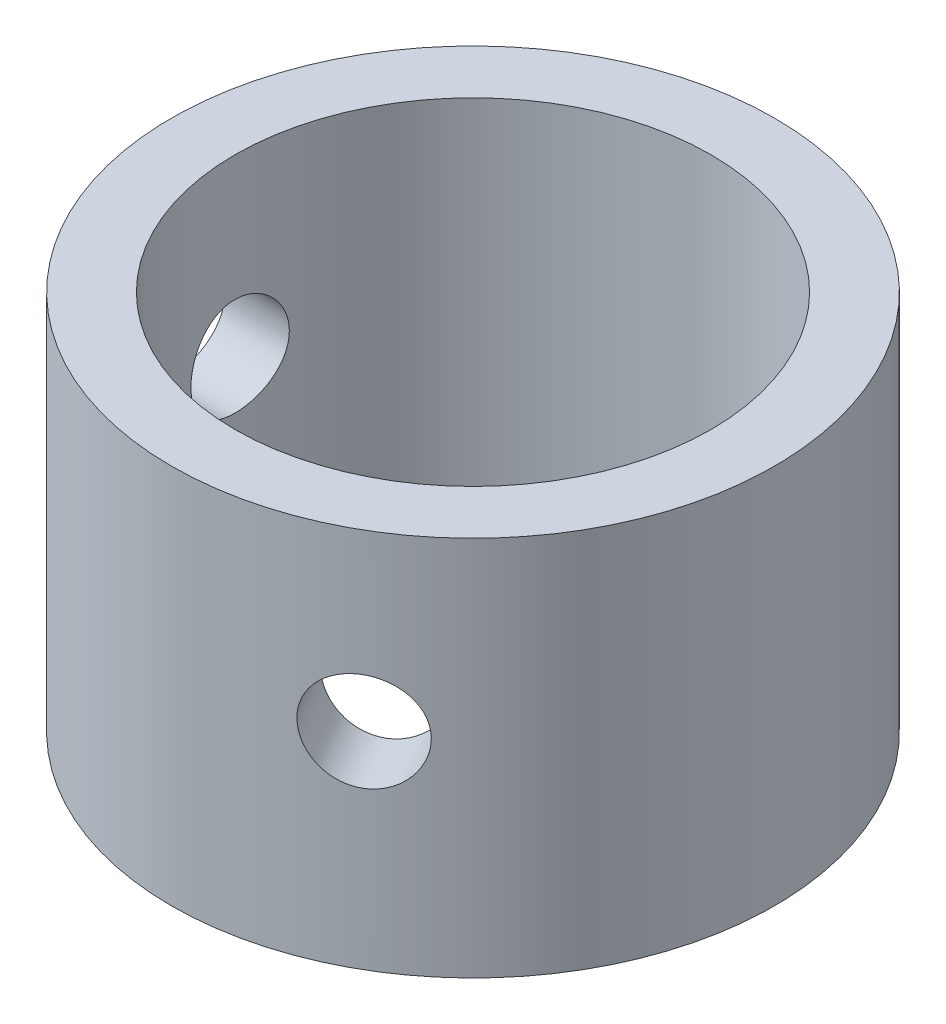
ISO-10303-21;
HEADER;
FILE_DESCRIPTION(('STEP AP214'),'2;1');
FILE_NAME('part.step','',(''),(''),'','','');
FILE_SCHEMA(('AUTOMOTIVE_DESIGN { 1 0 10303 214 1 1 1 1 }'));
ENDSEC;
DATA;
#1=APPLICATION_CONTEXT('core data for automotive mechanical design processes');
#2=APPLICATION_PROTOCOL_DEFINITION('international standard','automotive_design',2000,#1);
#3=PRODUCT_CONTEXT('',#1,'mechanical');
#4=PRODUCT('Part','Part','',(#3));
#5=PRODUCT_RELATED_PRODUCT_CATEGORY('part','',(#4));
#6=PRODUCT_DEFINITION_FORMATION('','',#4);
#7=PRODUCT_DEFINITION_CONTEXT('part definition',#1,'design');
#8=PRODUCT_DEFINITION('design','',#6,#7);
#9=PRODUCT_DEFINITION_SHAPE('','',#8);
#10=(LENGTH_UNIT() NAMED_UNIT(*) SI_UNIT(.MILLI.,.METRE.));
#11=(NAMED_UNIT(*) PLANE_ANGLE_UNIT() SI_UNIT($,.RADIAN.));
#12=(NAMED_UNIT(*) SI_UNIT($,.STERADIAN.) SOLID_ANGLE_UNIT());
#13=UNCERTAINTY_MEASURE_WITH_UNIT(LENGTH_MEASURE(1.E-05),#10,'distance_accuracy_value','');
#14=(GEOMETRIC_REPRESENTATION_CONTEXT(3) GLOBAL_UNCERTAINTY_ASSIGNED_CONTEXT((#13)) GLOBAL_UNIT_ASSIGNED_CONTEXT((#10,
#11,#12)) REPRESENTATION_CONTEXT('',''));
#15=CARTESIAN_POINT('',(0.,0.,0.));
#16=DIRECTION('',(0.,0.,1.));
#17=DIRECTION('',(1.,0.,0.));
#18=AXIS2_PLACEMENT_3D('',#15,#16,#17);
#19=CARTESIAN_POINT('',(0.,12.,0.));
#20=DIRECTION('',(0.,1.,0.));
#21=DIRECTION('',(0.,0.,1.));
#22=AXIS2_PLACEMENT_3D('',#19,#20,#21);
#23=PLANE('',#22);
#24=CARTESIAN_POINT('',(0.,12.,0.));
#25=DIRECTION('',(0.,1.,0.));
#26=DIRECTION('',(0.,0.,1.));
#27=AXIS2_PLACEMENT_3D('',#24,#25,#26);
#28=CIRCLE('',#27,9.5);
#29=CARTESIAN_POINT('',(0.,12.,9.5));
#30=VERTEX_POINT('',#29);
#31=EDGE_CURVE('E10',#30,#30,#28,.T.);
#32=ORIENTED_EDGE('',*,*,#31,.T.);
#33=EDGE_LOOP('',(#32));
#34=FACE_BOUND('',#33,.T.);
#35=CARTESIAN_POINT('',(0.,12.,0.));
#36=DIRECTION('',(0.,1.,0.));
#37=DIRECTION('',(0.,0.,1.));
#38=AXIS2_PLACEMENT_3D('',#35,#36,#37);
#39=CIRCLE('',#38,7.5);
#40=CARTESIAN_POINT('',(0.,12.,7.5));
#41=VERTEX_POINT('',#40);
#42=EDGE_CURVE('E44',#41,#41,#39,.T.);
#43=ORIENTED_EDGE('',*,*,#42,.F.);
#44=EDGE_LOOP('',(#43));
#45=FACE_BOUND('',#44,.T.);
#46=ADVANCED_FACE('F33',(#34,#45),#23,.T.);
#47=CARTESIAN_POINT('',(0.,0.,0.));
#48=DIRECTION('',(0.,1.,0.));
#49=DIRECTION('',(0.,0.,1.));
#50=AXIS2_PLACEMENT_3D('',#47,#48,#49);
#51=PLANE('',#50);
#52=CARTESIAN_POINT('',(0.,0.,0.));
#53=DIRECTION('',(0.,1.,0.));
#54=DIRECTION('',(0.,0.,1.));
#55=AXIS2_PLACEMENT_3D('',#52,#53,#54);
#56=CIRCLE('',#55,9.5);
#57=CARTESIAN_POINT('',(0.,0.,9.5));
#58=VERTEX_POINT('',#57);
#59=EDGE_CURVE('E37',#58,#58,#56,.T.);
#60=ORIENTED_EDGE('',*,*,#59,.F.);
#61=EDGE_LOOP('',(#60));
#62=FACE_BOUND('',#61,.T.);
#63=CARTESIAN_POINT('',(0.,0.,0.));
#64=DIRECTION('',(0.,1.,0.));
#65=DIRECTION('',(0.,0.,1.));
#66=AXIS2_PLACEMENT_3D('',#63,#64,#65);
#67=CIRCLE('',#66,7.5);
#68=CARTESIAN_POINT('',(0.,0.,7.5));
#69=VERTEX_POINT('',#68);
#70=EDGE_CURVE('E46',#69,#69,#67,.T.);
#71=ORIENTED_EDGE('',*,*,#70,.T.);
#72=EDGE_LOOP('',(#71));
#73=FACE_BOUND('',#72,.T.);
#74=ADVANCED_FACE('F118',(#62,#73),#51,.F.);
#75=CARTESIAN_POINT('',(0.,12.,0.));
#76=DIRECTION('',(0.,-1.,0.));
#77=DIRECTION('',(0.,0.,-1.));
#78=AXIS2_PLACEMENT_3D('',#75,#76,#77);
#79=CYLINDRICAL_SURFACE('',#78,9.5);
#80=CARTESIAN_POINT('',(6.02868923476453,6.5,-7.34199605765587));
#81=CARTESIAN_POINT('',(6.0286869757806,6.41355980270903,-7.34199913769664));
#82=CARTESIAN_POINT('',(6.02301028727632,6.32707174905695,-7.34667054904397));
#83=CARTESIAN_POINT('',(6.00041215924417,6.1565204614563,-7.36513806623131));
#84=CARTESIAN_POINT('',(5.9834802188082,6.07245956848889,-7.37894269310839));
#85=CARTESIAN_POINT('',(5.93874747171488,5.9092556363904,-7.41499143220311));
#86=CARTESIAN_POINT('',(5.91095558556981,5.83010862260822,-7.4372286173567));
#87=CARTESIAN_POINT('',(5.84508882223188,5.67885100418678,-7.48910448507353));
#88=CARTESIAN_POINT('',(5.80701515856541,5.60673957052619,-7.51874229413293));
#89=CARTESIAN_POINT('',(5.72100383208927,5.47090939817837,-7.58439573142505));
#90=CARTESIAN_POINT('',(5.67298546605089,5.40726680070669,-7.62046318126345));
#91=CARTESIAN_POINT('',(5.56830240158039,5.29084189483386,-7.69728623177612));
#92=CARTESIAN_POINT('',(5.51163719932154,5.23806021968913,-7.73804210559754));
#93=CARTESIAN_POINT('',(5.39057319902511,5.14457069407608,-7.82286431113742));
#94=CARTESIAN_POINT('',(5.32613206624466,5.10393354795796,-7.86694822616774));
#95=CARTESIAN_POINT('',(5.19133631884386,5.0363409208529,-7.95654250032146));
#96=CARTESIAN_POINT('',(5.12098207319611,5.00938458693403,-8.00205277033071));
#97=CARTESIAN_POINT('',(4.97684352509813,4.97015121690717,-8.09247794095882));
#98=CARTESIAN_POINT('',(4.90309510384275,4.95774633512774,-8.13739454544973));
#99=CARTESIAN_POINT('',(4.75364162851019,4.94757057846949,-8.22559526944653));
#100=CARTESIAN_POINT('',(4.67793670244957,4.94979874853423,-8.26887949530755));
#101=CARTESIAN_POINT('',(4.52749902902457,4.96872588378749,-8.35219007297692));
#102=CARTESIAN_POINT('',(4.4527638752254,4.98528727214655,-8.3922434519385));
#103=CARTESIAN_POINT('',(4.30575145382308,5.03219424201618,-8.46861089272541));
#104=CARTESIAN_POINT('',(4.23347425868149,5.06254022952398,-8.50492484437491));
#105=CARTESIAN_POINT('',(4.09325169949548,5.13629261096087,-8.57329622789762));
#106=CARTESIAN_POINT('',(4.02532682552685,5.17975596231448,-8.60533419973811));
#107=CARTESIAN_POINT('',(3.89625375133825,5.27846760956071,-8.66454018219711));
#108=CARTESIAN_POINT('',(3.83510607781668,5.33371682043126,-8.69170781441241));
#109=CARTESIAN_POINT('',(3.72086325012785,5.4551956609237,-8.74123021156912));
#110=CARTESIAN_POINT('',(3.66787000497565,5.52154550725941,-8.76352533539733));
#111=CARTESIAN_POINT('',(3.5725838311403,5.66293639689981,-8.80280120866415));
#112=CARTESIAN_POINT('',(3.53029099336165,5.73797751403266,-8.81978191295478));
#113=CARTESIAN_POINT('',(3.45786053804082,5.89475470353345,-8.84843073552049));
#114=CARTESIAN_POINT('',(3.42773560902047,5.97649765821077,-8.86009330975059));
#115=CARTESIAN_POINT('',(3.38082989388738,6.14428406543431,-8.87809813715925));
#116=CARTESIAN_POINT('',(3.36404798470531,6.23032715539417,-8.88444083810897));
#117=CARTESIAN_POINT('',(3.34458752362904,6.40321621523058,-8.89178512790781));
#118=CARTESIAN_POINT('',(3.34174968085059,6.49004171013285,-8.89284704382244));
#119=CARTESIAN_POINT('',(3.34985500839473,6.6629525990059,-8.88979693006719));
#120=CARTESIAN_POINT('',(3.36079766952988,6.74903802020395,-8.88568509156672));
#121=CARTESIAN_POINT('',(3.39593623980087,6.91749398375436,-8.87231442841983));
#122=CARTESIAN_POINT('',(3.42005180955335,6.99988380156442,-8.86308679908791));
#123=CARTESIAN_POINT('',(3.48059754756245,7.15922073162248,-8.83948472198809));
#124=CARTESIAN_POINT('',(3.51702842477657,7.23616753022276,-8.82510997791249));
#125=CARTESIAN_POINT('',(3.60130450837535,7.38318357050124,-8.79105692288382));
#126=CARTESIAN_POINT('',(3.64924792698526,7.4531858818204,-8.77133277836482));
#127=CARTESIAN_POINT('',(3.75475522401982,7.58363474056835,-8.72668817666493));
#128=CARTESIAN_POINT('',(3.81231974984666,7.6440806444156,-8.70176736977381));
#129=CARTESIAN_POINT('',(3.93581918264171,7.75431251612721,-8.64661420759735));
#130=CARTESIAN_POINT('',(4.00183162141808,7.80398652273179,-8.61633150592131));
#131=CARTESIAN_POINT('',(4.1396512931977,7.89048122631682,-8.55097043567342));
#132=CARTESIAN_POINT('',(4.21145834477229,7.92730232552827,-8.51589221722479));
#133=CARTESIAN_POINT('',(4.3582942876746,7.9868707465621,-8.44168249117429));
#134=CARTESIAN_POINT('',(4.43330818545923,8.00967723017636,-8.40256884786344));
#135=CARTESIAN_POINT('',(4.58453181858317,8.04075974958856,-8.32102411724996));
#136=CARTESIAN_POINT('',(4.66074145932158,8.04903692907855,-8.27859329133812));
#137=CARTESIAN_POINT('',(4.81119797991175,8.05079406292841,-8.19205831223232));
#138=CARTESIAN_POINT('',(4.8854573733535,8.04444457631604,-8.147979283675));
#139=CARTESIAN_POINT('',(5.03084435559193,8.01749680000318,-8.05902414141261));
#140=CARTESIAN_POINT('',(5.1019719601703,7.9968985821136,-8.01414803172577));
#141=CARTESIAN_POINT('',(5.23916121087721,7.94210243987344,-7.92514193782238));
#142=CARTESIAN_POINT('',(5.30522795899354,7.90791843280434,-7.88101123808827));
#143=CARTESIAN_POINT('',(5.43078265421484,7.82693987358513,-7.79502385106598));
#144=CARTESIAN_POINT('',(5.49027031041483,7.7801447641293,-7.75316726437292));
#145=CARTESIAN_POINT('',(5.60194686038146,7.67466502174741,-7.6728730235493));
#146=CARTESIAN_POINT('',(5.65404826085874,7.61585525504724,-7.63447804680929));
#147=CARTESIAN_POINT('',(5.74905183165025,7.48827844643867,-7.56319638992428));
#148=CARTESIAN_POINT('',(5.79195184421896,7.41950907530128,-7.53031100218477));
#149=CARTESIAN_POINT('',(5.8678939214364,7.27341522814849,-7.47128880994132));
#150=CARTESIAN_POINT('',(5.90086752145479,7.19603616124278,-7.44519903524831));
#151=CARTESIAN_POINT('',(5.95583368376486,7.03532135329781,-7.40130346763535));
#152=CARTESIAN_POINT('',(5.97783731029204,6.95199171136773,-7.38348932921091));
#153=CARTESIAN_POINT('',(6.00561056173239,6.80693860434724,-7.36090021290156));
#154=CARTESIAN_POINT('',(6.01425486872405,6.7460974691015,-7.35382855586909));
#155=CARTESIAN_POINT('',(6.02579496369386,6.62351235790366,-7.34437541747898));
#156=CARTESIAN_POINT('',(6.02869084898825,6.56176839725349,-7.34199385672173));
#157=CARTESIAN_POINT('',(6.02868923476453,6.5,-7.34199605765587));
#158=B_SPLINE_CURVE_WITH_KNOTS('',3,(#80,#81,#82,#83,#84,#85,#86,#87,#88,#89,#90,#91,#92,#93,
#94,#95,#96,#97,#98,#99,#100,#101,#102,#103,#104,#105,#106,#107,#108,#109,#110,#111,#112,#113,
#114,#115,#116,#117,#118,#119,#120,#121,#122,#123,#124,#125,#126,#127,#128,#129,#130,#131,#132,
#133,#134,#135,#136,#137,#138,#139,#140,#141,#142,#143,#144,#145,#146,#147,#148,#149,#150,#151,
#152,#153,#154,#155,#156,#157),.UNSPECIFIED.,.T.,.F.,(4,2,2,2,2,2,2,2,2,2,2,2,2,2,2,2,2,2,2,2,2,
2,2,2,2,2,2,2,2,2,2,2,2,2,2,2,2,2,4),(0.,0.259094739498977,0.518431548733875,0.777555781349344,
1.03664944368977,1.29793444234965,1.55923467116593,1.82202778820658,2.08480451936444,
2.34525484062461,2.60568816322411,2.86364910660214,3.121617648186,3.38072284706572,
3.63984816852279,3.90198677752451,4.16412761343036,4.42654110468619,4.68893250650859,
4.94831938154551,5.20769667255965,5.46550944543892,5.72333706240035,5.98344762135703,
6.24357569014808,6.50629007280762,6.76899623309857,7.0305856379342,7.29215445051433,
7.55068861725124,7.80922148103406,8.06749018360579,8.3257703013758,8.58689176738307,
8.84807440015635,9.1110192361813,9.37369832870916,9.55884526539988,9.74398906767269),.UNSPECIFIED.);
#159=CARTESIAN_POINT('',(6.02868923476453,6.5,-7.34199605765587));
#160=VERTEX_POINT('',#159);
#161=EDGE_CURVE('E91',#160,#160,#158,.T.);
#162=ORIENTED_EDGE('',*,*,#161,.F.);
#163=EDGE_LOOP('',(#162));
#164=FACE_BOUND('',#163,.T.);
#165=CARTESIAN_POINT('',(3.34401048303288,6.5,8.8919960576558));
#166=CARTESIAN_POINT('',(3.34401427991839,6.41355980270903,8.89199564133871));
#167=CARTESIAN_POINT('',(3.35089818506885,6.32707174905695,8.8894151905583));
#168=CARTESIAN_POINT('',(3.37819058811398,6.1565204614563,8.87907839619816));
#169=CARTESIAN_POINT('',(3.39861171589729,6.07245956848889,8.87131721908378));
#170=CARTESIAN_POINT('',(3.45219721327437,5.90925563639039,8.85060189326727));
#171=CARTESIAN_POINT('',(3.48535112359858,5.83010862260822,8.83765200642335));
#172=CARTESIAN_POINT('',(3.56321032455367,5.67885100418678,8.80654764996605));
#173=CARTESIAN_POINT('',(3.60791425194486,5.60673957052619,8.78839379454545));
#174=CARTESIAN_POINT('',(3.70777745972368,5.47090939817837,8.74673251944998));
#175=CARTESIAN_POINT('',(3.76302197055264,5.40726680070669,8.72318111953171));
#176=CARTESIAN_POINT('',(3.88189421612808,5.29084189483386,8.67093445161059));
#177=CARTESIAN_POINT('',(3.94552243934029,5.23806021968913,8.64223888385456));
#178=CARTESIAN_POINT('',(4.07951262429106,5.14457069407608,8.57980548688402));
#179=CARTESIAN_POINT('',(4.14991098099582,5.10393354795795,8.54603978636267));
#180=CARTESIAN_POINT('',(4.29489977214697,5.0363409208529,8.47410038186833));
#181=CARTESIAN_POINT('',(4.36948994493195,5.00938458693403,8.43592695287791));
#182=CARTESIAN_POINT('',(4.51986971388643,4.97015121690717,8.3563118938745));
#183=CARTESIAN_POINT('',(4.59564284505498,4.95774633512774,8.31490218982381));
#184=CARTESIAN_POINT('',(4.74675365033467,4.94757057846949,8.22957204550034));
#185=CARTESIAN_POINT('',(4.82209135254376,4.94979874853423,8.18565176927073));
#186=CARTESIAN_POINT('',(4.9694592659219,4.96872588378749,8.09702421123314));
#187=CARTESIAN_POINT('',(5.04151408650961,4.98528727214655,8.05232835896811));
#188=CARTESIAN_POINT('',(5.18115644095424,5.03219424201618,7.9631955877553));
#189=CARTESIAN_POINT('',(5.2487438431653,5.06254022952398,7.91875867647314));
#190=CARTESIAN_POINT('',(5.37806647778086,5.13629261096087,7.83150806979575));
#191=CARTESIAN_POINT('',(5.43977461226477,5.17975596231448,7.7887023893103));
#192=CARTESIAN_POINT('',(5.55558503422458,5.27846760956071,7.70652481934792));
#193=CARTESIAN_POINT('',(5.6096867306445,5.33371682043126,7.66715319680357));
#194=CARTESIAN_POINT('',(5.70969579848293,5.45519566092371,7.59297720440324));
#195=CARTESIAN_POINT('',(5.75550056467477,5.52154550725941,7.55823126978656));
#196=CARTESIAN_POINT('',(5.83715755559733,5.66293639689982,7.49534895924913));
#197=CARTESIAN_POINT('',(5.8730096957765,5.73797751403266,7.46721263948001));
#198=CARTESIAN_POINT('',(5.93403553156733,5.89475470353345,7.41881043644735));
#199=CARTESIAN_POINT('',(5.95919808163429,5.97649765821077,7.39855276974357));
#200=CARTESIAN_POINT('',(5.99824357712749,6.14428406543432,7.36693364255997));
#201=CARTESIAN_POINT('',(6.01212747186959,6.23032715539417,7.35557143335916));
#202=CARTESIAN_POINT('',(6.02821804394627,6.40321621523058,7.34239032459717));
#203=CARTESIAN_POINT('',(6.03055661149425,6.49004171013285,7.3404636386164));
#204=CARTESIAN_POINT('',(6.0238624717257,6.6629525990059,7.345958001298));
#205=CARTESIAN_POINT('',(6.01483018456046,6.74903802020395,7.3533787045758));
#206=CARTESIAN_POINT('',(5.98568156547431,6.91749398375437,7.37712426750969));
#207=CARTESIAN_POINT('',(5.96563241917993,6.99988380156443,7.39339514887612));
#208=CARTESIAN_POINT('',(5.91491955182485,7.15922073162248,7.43402825753297));
#209=CARTESIAN_POINT('',(5.88425521967542,7.23616753022277,7.45839095064475));
#210=CARTESIAN_POINT('',(5.81262636714474,7.38318357050124,7.51434965245842));
#211=CARTESIAN_POINT('',(5.77157304761841,7.4531858818204,7.54600779865937));
#212=CARTESIAN_POINT('',(5.68015603988719,7.58363474056835,7.61505749732599));
#213=CARTESIAN_POINT('',(5.62979172512325,7.6440806444156,7.65244943560327));
#214=CARTESIAN_POINT('',(5.52027796918187,7.75431251612721,7.73182650066853));
#215=CARTESIAN_POINT('',(5.46104616084701,7.80398652273179,7.77385359877661));
#216=CARTESIAN_POINT('',(5.33553197770398,7.89048122631682,7.86052840055505));
#217=CARTESIAN_POINT('',(5.26924982362068,7.92730232552827,7.90517602216519));
#218=CARTESIAN_POINT('',(5.1315643442019,7.9868707465621,7.99523481588197));
#219=CARTESIAN_POINT('',(5.06018398656782,8.00967723017636,8.04064193534493));
#220=CARTESIAN_POINT('',(4.91395236174983,8.04075974958856,8.1308330779761));
#221=CARTESIAN_POINT('',(4.83910136823741,8.04903692907855,8.17561714991292));
#222=CARTESIAN_POINT('',(4.68893161772075,8.05079406292841,8.26264882935613));
#223=CARTESIAN_POINT('',(4.6136283624951,8.04444457631604,8.30491983626766));
#224=CARTESIAN_POINT('',(4.46389745837939,8.01749680000318,8.38635108513449));
#225=CARTESIAN_POINT('',(4.38946980507839,7.9968985821136,8.42551134276628));
#226=CARTESIAN_POINT('',(4.24379364131298,7.94210243987344,8.49981767205291));
#227=CARTESIAN_POINT('',(4.17254196019828,7.90791843280434,8.53496780440003));
#228=CARTESIAN_POINT('',(4.03529735102129,7.82693987358513,8.60070766651495));
#229=CARTESIAN_POINT('',(3.9693046555294,7.7801447641293,8.63129719464919));
#230=CARTESIAN_POINT('',(3.84392952821524,7.67466502174741,8.6878648035155));
#231=CARTESIAN_POINT('',(3.78462780274204,7.61585525504724,8.71378845153155));
#232=CARTESIAN_POINT('',(3.67539429166002,7.48827844643867,8.76042312884473));
#233=CARTESIAN_POINT('',(3.62546470417995,7.41950907530128,8.78113293568215));
#234=CARTESIAN_POINT('',(3.53637894770134,7.27341522814849,8.81738960764689));
#235=CARTESIAN_POINT('',(3.497297740029,7.19603616124277,8.83290069557053));
#236=CARTESIAN_POINT('',(3.43179998220759,7.03532135329781,8.85855500467312));
#237=CARTESIAN_POINT('',(3.40537067252192,6.95199171136773,8.86870363500882));
#238=CARTESIAN_POINT('',(3.3719212982288,6.80693860434724,8.88146141814718));
#239=CARTESIAN_POINT('',(3.361474910096,6.7460974691015,8.88541177908383));
#240=CARTESIAN_POINT('',(3.34751820461977,6.62351235790366,8.89067922529471));
#241=CARTESIAN_POINT('',(3.34400776985614,6.56176839725349,8.89199635514747));
#242=CARTESIAN_POINT('',(3.34401048303288,6.5,8.8919960576558));
#243=B_SPLINE_CURVE_WITH_KNOTS('',3,(#165,#166,#167,#168,#169,#170,#171,#172,#173,#174,#175,
#176,#177,#178,#179,#180,#181,#182,#183,#184,#185,#186,#187,#188,#189,#190,#191,#192,#193,#194,
#195,#196,#197,#198,#199,#200,#201,#202,#203,#204,#205,#206,#207,#208,#209,#210,#211,#212,#213,
#214,#215,#216,#217,#218,#219,#220,#221,#222,#223,#224,#225,#226,#227,#228,#229,#230,#231,#232,
#233,#234,#235,#236,#237,#238,#239,#240,#241,#242),.UNSPECIFIED.,.T.,.F.,(4,2,2,2,2,2,2,2,2,2,2,
2,2,2,2,2,2,2,2,2,2,2,2,2,2,2,2,2,2,2,2,2,2,2,2,2,2,2,4),(0.,0.259094739498977,
0.518431548733877,0.777555781349345,1.03664944368978,1.29793444234965,1.55923467116593,
1.82202778820658,2.08480451936445,2.34525484062461,2.60568816322411,2.86364910660214,
3.12161764818601,3.38072284706572,3.6398481685228,3.90198677752451,4.16412761343036,
4.42654110468619,4.68893250650859,4.94831938154552,5.20769667255966,5.46550944543893,
5.72333706240035,5.98344762135703,6.24357569014808,6.50629007280763,6.76899623309857,
7.0305856379342,7.29215445051433,7.55068861725125,7.80922148103406,8.06749018360579,
8.3257703013758,8.58689176738307,8.84807440015636,9.1110192361813,9.37369832870916,
9.55884526539989,9.74398906767269),.UNSPECIFIED.);
#244=CARTESIAN_POINT('',(3.34401048303288,6.5,8.8919960576558));
#245=VERTEX_POINT('',#244);
#246=EDGE_CURVE('E83',#245,#245,#243,.T.);
#247=ORIENTED_EDGE('',*,*,#246,.F.);
#248=EDGE_LOOP('',(#247));
#249=FACE_BOUND('',#248,.T.);
#250=CARTESIAN_POINT('',(-9.37269971779743,6.5,-1.55));
#251=CARTESIAN_POINT('',(-9.37270125569901,6.41355980270903,-1.54999650364215));
#252=CARTESIAN_POINT('',(-9.37390847234519,6.32707174905695,-1.5427446415144));
#253=CARTESIAN_POINT('',(-9.37860274735818,6.1565204614563,-1.51394032996692));
#254=CARTESIAN_POINT('',(-9.38209193470552,6.07245956848889,-1.49237452597546));
#255=CARTESIAN_POINT('',(-9.39094468498928,5.90925563639039,-1.43561046106422));
#256=CARTESIAN_POINT('',(-9.39630670916842,5.83010862260822,-1.40042338906672));
#257=CARTESIAN_POINT('',(-9.40829914678558,5.67885100418678,-1.31744316489259));
#258=CARTESIAN_POINT('',(-9.4149294105103,5.60673957052619,-1.26965150041259));
#259=CARTESIAN_POINT('',(-9.42878129181298,5.47090939817837,-1.16233678802499));
#260=CARTESIAN_POINT('',(-9.43600743660356,5.40726680070669,-1.10271793826833));
#261=CARTESIAN_POINT('',(-9.4501966177085,5.29084189483386,-0.973648219834541));
#262=CARTESIAN_POINT('',(-9.45715963866186,5.23806021968913,-0.904196778257088));
#263=CARTESIAN_POINT('',(-9.47008582331621,5.14457069407608,-0.756941175746672));
#264=CARTESIAN_POINT('',(-9.47604304724051,5.10393354795795,-0.679091560194996));
#265=CARTESIAN_POINT('',(-9.48623609099087,5.0363409208529,-0.517557881546932));
#266=CARTESIAN_POINT('',(-9.49047201812809,5.00938458693403,-0.433874182547267));
#267=CARTESIAN_POINT('',(-9.49671323898459,4.97015121690717,-0.263833952915749));
#268=CARTESIAN_POINT('',(-9.49873794889777,4.95774633512774,-0.177507644374141));
#269=CARTESIAN_POINT('',(-9.5003952788449,4.94757057846949,-0.00397677605387123));
#270=CARTESIAN_POINT('',(-9.50002805499337,4.94979874853423,0.0832277260367498));
#271=CARTESIAN_POINT('',(-9.4969582949465,4.96872588378749,0.255165861743719));
#272=CARTESIAN_POINT('',(-9.49427796173505,4.98528727214655,0.339915092970321));
#273=CARTESIAN_POINT('',(-9.48690789477737,5.03219424201618,0.505415304970048));
#274=CARTESIAN_POINT('',(-9.48221810184683,5.06254022952398,0.5861661679017));
#275=CARTESIAN_POINT('',(-9.47131817727639,5.13629261096087,0.741788158101807));
#276=CARTESIAN_POINT('',(-9.46510143779167,5.17975596231448,0.816631810427742));
#277=CARTESIAN_POINT('',(-9.45183878556288,5.27846760956071,0.958015362849124));
#278=CARTESIAN_POINT('',(-9.44479280846122,5.33371682043126,1.02455461760878));
#279=CARTESIAN_POINT('',(-9.43055904861082,5.45519566092371,1.14825300716582));
#280=CARTESIAN_POINT('',(-9.42337056965047,5.52154550725941,1.20529406561071));
#281=CARTESIAN_POINT('',(-9.40974138673767,5.66293639689981,1.30745224941495));
#282=CARTESIAN_POINT('',(-9.4033006891382,5.73797751403266,1.35256927347471));
#283=CARTESIAN_POINT('',(-9.3918960696082,5.89475470353345,1.42962029907308));
#284=CARTESIAN_POINT('',(-9.3869336906548,5.97649765821077,1.46154054000695));
#285=CARTESIAN_POINT('',(-9.37907347101491,6.14428406543432,1.51116449459922));
#286=CARTESIAN_POINT('',(-9.37617545657495,6.23032715539417,1.52886940474975));
#287=CARTESIAN_POINT('',(-9.37280556757536,6.40321621523058,1.54939480331058));
#288=CARTESIAN_POINT('',(-9.3723062923449,6.49004171013285,1.55238340520598));
#289=CARTESIAN_POINT('',(-9.37371748012048,6.6629525990059,1.54383892876914));
#290=CARTESIAN_POINT('',(-9.37562785409039,6.74903802020395,1.53230638699086));
#291=CARTESIAN_POINT('',(-9.38161780527523,6.91749398375437,1.49519016091007));
#292=CARTESIAN_POINT('',(-9.38568422873332,6.99988380156442,1.46969165021173));
#293=CARTESIAN_POINT('',(-9.39551709938735,7.15922073162248,1.40545646445506));
#294=CARTESIAN_POINT('',(-9.40128364445204,7.23616753022276,1.36671902726768));
#295=CARTESIAN_POINT('',(-9.41393087552014,7.38318357050124,1.27670727042534));
#296=CARTESIAN_POINT('',(-9.42082097460372,7.4531858818204,1.22532497970538));
#297=CARTESIAN_POINT('',(-9.43491126390705,7.58363474056835,1.11163067933888));
#298=CARTESIAN_POINT('',(-9.44211147496996,7.6440806444156,1.04931793417048));
#299=CARTESIAN_POINT('',(-9.45609715182362,7.75431251612721,0.914787706928759));
#300=CARTESIAN_POINT('',(-9.46287778226513,7.80398652273179,0.842477907144643));
#301=CARTESIAN_POINT('',(-9.47518327090173,7.89048122631682,0.690442035118306));
#302=CARTESIAN_POINT('',(-9.48070816839301,7.92730232552827,0.610716195059544));
#303=CARTESIAN_POINT('',(-9.48985863187654,7.9868707465621,0.446447675292249));
#304=CARTESIAN_POINT('',(-9.4934921720271,8.00967723017636,0.36192691251844));
#305=CARTESIAN_POINT('',(-9.49848418033304,8.04075974958856,0.190191039273796));
#306=CARTESIAN_POINT('',(-9.49984282755903,8.04903692907855,0.102976141425127));
#307=CARTESIAN_POINT('',(-9.50012959763254,8.05079406292841,-0.070590517123879));
#308=CARTESIAN_POINT('',(-9.49908573584864,8.04444457631604,-0.156940552592718));
#309=CARTESIAN_POINT('',(-9.49474181397135,8.01749680000318,-0.327326943721949));
#310=CARTESIAN_POINT('',(-9.49144176524872,7.9968985821136,-0.411363311040573));
#311=CARTESIAN_POINT('',(-9.48295485219022,7.94210243987344,-0.574675734230598));
#312=CARTESIAN_POINT('',(-9.47776991919186,7.90791843280434,-0.65395656631183));
#313=CARTESIAN_POINT('',(-9.46608000523616,7.82693987358513,-0.805683815449032));
#314=CARTESIAN_POINT('',(-9.45957496594425,7.7801447641293,-0.878129930276345));
#315=CARTESIAN_POINT('',(-9.44587638859673,7.67466502174741,-1.01499177996626));
#316=CARTESIAN_POINT('',(-9.43867606360081,7.61585525504724,-1.07931040472234));
#317=CARTESIAN_POINT('',(-9.42444612331029,7.48827844643867,-1.19722673892052));
#318=CARTESIAN_POINT('',(-9.41741654839893,7.41950907530128,-1.25082193349745));
#319=CARTESIAN_POINT('',(-9.40427286913778,7.27341522814849,-1.34610079770564));
#320=CARTESIAN_POINT('',(-9.39816526148381,7.19603616124278,-1.38770166032229));
#321=CARTESIAN_POINT('',(-9.38763366597249,7.03532135329781,-1.45725153703784));
#322=CARTESIAN_POINT('',(-9.38320798281398,6.95199171136773,-1.48521430579798));
#323=CARTESIAN_POINT('',(-9.37753185996122,6.80693860434724,-1.52056120524568));
#324=CARTESIAN_POINT('',(-9.37572977882007,6.7460974691015,-1.53158322321481));
#325=CARTESIAN_POINT('',(-9.37331316831365,6.62351235790366,-1.54630380781581));
#326=CARTESIAN_POINT('',(-9.37269861884441,6.56176839725349,-1.55000249842582));
#327=CARTESIAN_POINT('',(-9.37269971779743,6.5,-1.55));
#328=B_SPLINE_CURVE_WITH_KNOTS('',3,(#250,#251,#252,#253,#254,#255,#256,#257,#258,#259,#260,
#261,#262,#263,#264,#265,#266,#267,#268,#269,#270,#271,#272,#273,#274,#275,#276,#277,#278,#279,
#280,#281,#282,#283,#284,#285,#286,#287,#288,#289,#290,#291,#292,#293,#294,#295,#296,#297,#298,
#299,#300,#301,#302,#303,#304,#305,#306,#307,#308,#309,#310,#311,#312,#313,#314,#315,#316,#317,
#318,#319,#320,#321,#322,#323,#324,#325,#326,#327),.UNSPECIFIED.,.T.,.F.,(4,2,2,2,2,2,2,2,2,2,2,
2,2,2,2,2,2,2,2,2,2,2,2,2,2,2,2,2,2,2,2,2,2,2,2,2,2,2,4),(0.,0.259094739498977,
0.518431548733877,0.777555781349345,1.03664944368978,1.29793444234965,1.55923467116593,
1.82202778820658,2.08480451936445,2.34525484062461,2.60568816322411,2.86364910660214,
3.12161764818601,3.38072284706573,3.6398481685228,3.90198677752451,4.16412761343036,
4.42654110468619,4.68893250650859,4.94831938154552,5.20769667255966,5.46550944543893,
5.72333706240035,5.98344762135703,6.24357569014808,6.50629007280763,6.76899623309857,
7.0305856379342,7.29215445051433,7.55068861725125,7.80922148103406,8.06749018360579,
8.3257703013758,8.58689176738307,8.84807440015636,9.1110192361813,9.37369832870917,
9.55884526539989,9.7439890676727),.UNSPECIFIED.);
#329=CARTESIAN_POINT('',(-9.37269971779743,6.5,-1.55));
#330=VERTEX_POINT('',#329);
#331=EDGE_CURVE('E49',#330,#330,#328,.T.);
#332=ORIENTED_EDGE('',*,*,#331,.F.);
#333=EDGE_LOOP('',(#332));
#334=FACE_BOUND('',#333,.T.);
#335=ORIENTED_EDGE('',*,*,#31,.F.);
#336=EDGE_LOOP('',(#335));
#337=FACE_BOUND('',#336,.T.);
#338=ORIENTED_EDGE('',*,*,#59,.T.);
#339=EDGE_LOOP('',(#338));
#340=FACE_BOUND('',#339,.T.);
#341=ADVANCED_FACE('F35',(#164,#249,#334,#337,#340),#79,.T.);
#342=CARTESIAN_POINT('',(0.,12.,0.));
#343=DIRECTION('',(0.,-1.,0.));
#344=DIRECTION('',(0.,0.,-1.));
#345=AXIS2_PLACEMENT_3D('',#342,#343,#344);
#346=CYLINDRICAL_SURFACE('',#345,7.5);
#347=CARTESIAN_POINT('',(5.01138216656751,6.5,-5.57996852863967));
#348=CARTESIAN_POINT('',(5.01138033771143,6.41393928408668,-5.57997157877863));
#349=CARTESIAN_POINT('',(5.00591903401044,6.32784004513137,-5.58488987523024));
#350=CARTESIAN_POINT('',(4.98417383893114,6.15808168907942,-5.60430332078319));
#351=CARTESIAN_POINT('',(4.96788157776778,6.0744245113542,-5.6188058762134));
#352=CARTESIAN_POINT('',(4.92481544725087,5.91203067366765,-5.65658970812023));
#353=CARTESIAN_POINT('',(4.89805237407615,5.83328904207479,-5.67986194150514));
#354=CARTESIAN_POINT('',(4.83455086378546,5.68276490937914,-5.7340083142878));
#355=CARTESIAN_POINT('',(4.79781286090786,5.61098210552243,-5.76488212276093));
#356=CARTESIAN_POINT('',(4.71446387426091,5.47532709586673,-5.83324667568749));
#357=CARTESIAN_POINT('',(4.66772590430486,5.41157520542419,-5.87082138017664));
#358=CARTESIAN_POINT('',(4.56556092294517,5.29484323964738,-5.95061738030192));
#359=CARTESIAN_POINT('',(4.51013328057861,5.24186394716078,-5.99283901328825));
#360=CARTESIAN_POINT('',(4.39114620238831,5.14771103653417,-6.08057077339846));
#361=CARTESIAN_POINT('',(4.32751568837007,5.10665223747507,-6.12610791862018));
#362=CARTESIAN_POINT('',(4.19398771817732,5.03824739744974,-6.21828269799882));
#363=CARTESIAN_POINT('',(4.12409088961963,5.0108999849935,-6.26492022160088));
#364=CARTESIAN_POINT('',(3.98083463737159,4.97107010004888,-6.35689358352521));
#365=CARTESIAN_POINT('',(3.90753761489404,4.95838429325641,-6.4022385042335));
#366=CARTESIAN_POINT('',(3.75861775202797,4.9476028624026,-6.49078526410591));
#367=CARTESIAN_POINT('',(3.68299515109042,4.94950574120756,-6.53398732271888));
#368=CARTESIAN_POINT('',(3.53281395901288,4.96769440699761,-6.61637770876111));
#369=CARTESIAN_POINT('',(3.45825666784731,4.98376112153646,-6.65561706585703));
#370=CARTESIAN_POINT('',(3.31127324451392,5.02947334410138,-6.72995220731469));
#371=CARTESIAN_POINT('',(3.23884720175082,5.05911942091262,-6.76504781803401));
#372=CARTESIAN_POINT('',(3.09785369242204,5.13134858216297,-6.83076852849914));
#373=CARTESIAN_POINT('',(3.02931514161235,5.1740165254634,-6.86136229269493));
#374=CARTESIAN_POINT('',(2.89874304937628,5.27101527811111,-6.91753919065653));
#375=CARTESIAN_POINT('',(2.83671030589571,5.32534751561504,-6.94312171011973));
#376=CARTESIAN_POINT('',(2.72004953160695,5.4453312579723,-6.98966055733601));
#377=CARTESIAN_POINT('',(2.66558068613007,5.51117450138036,-7.01052198921675));
#378=CARTESIAN_POINT('',(2.56732861353241,5.65167973152203,-7.04709730658685));
#379=CARTESIAN_POINT('',(2.52354561688216,5.72634190840932,-7.06281108105493));
#380=CARTESIAN_POINT('',(2.44819574977911,5.88264328711138,-7.0892837402225));
#381=CARTESIAN_POINT('',(2.41665857049108,5.96429886778338,-7.10003059398785));
#382=CARTESIAN_POINT('',(2.36722179814708,6.13210780023772,-7.11666693516582));
#383=CARTESIAN_POINT('',(2.34932029568006,6.2182605204772,-7.12255710267233));
#384=CARTESIAN_POINT('',(2.32810617919834,6.39093391131854,-7.1295192921288));
#385=CARTESIAN_POINT('',(2.32453331118993,6.47741918037434,-7.13067727323394));
#386=CARTESIAN_POINT('',(2.33140953370082,6.64976651234094,-7.12843196438802));
#387=CARTESIAN_POINT('',(2.34185777147852,6.73562861283257,-7.12502895182944));
#388=CARTESIAN_POINT('',(2.37615668895497,6.9033790871796,-7.11366269108483));
#389=CARTESIAN_POINT('',(2.39986750068309,6.98529939673785,-7.10574701725238));
#390=CARTESIAN_POINT('',(2.45966027351365,7.14387376169668,-7.08527091029474));
#391=CARTESIAN_POINT('',(2.49574331197115,7.22052735778168,-7.07271007266814));
#392=CARTESIAN_POINT('',(2.5795376592487,7.36756220823716,-7.04258387518898));
#393=CARTESIAN_POINT('',(2.6274031807277,7.43784182149657,-7.02495157594338));
#394=CARTESIAN_POINT('',(2.73282121475616,7.56906612427428,-6.98461638424453));
#395=CARTESIAN_POINT('',(2.79037479523318,7.63000978326186,-6.96191293270114));
#396=CARTESIAN_POINT('',(2.91428817900911,7.74185806217407,-6.91096785179759));
#397=CARTESIAN_POINT('',(2.98077746970858,7.79258070123605,-6.8826411249576));
#398=CARTESIAN_POINT('',(3.11962197081639,7.88125267589494,-6.82083021149086));
#399=CARTESIAN_POINT('',(3.19197692437392,7.91920257042155,-6.78734625063589));
#400=CARTESIAN_POINT('',(3.3397746768629,7.98099061541918,-6.71584675462216));
#401=CARTESIAN_POINT('',(3.4151962895428,8.00491225789435,-6.67785968216075));
#402=CARTESIAN_POINT('',(3.56714711454949,8.03822806501389,-6.5979408808799));
#403=CARTESIAN_POINT('',(3.64367618268701,8.04762410399854,-6.5560096617422));
#404=CARTESIAN_POINT('',(3.79408046849736,8.0515453297595,-6.47010942798466));
#405=CARTESIAN_POINT('',(3.8679785772837,8.04634344586215,-6.42619271939503));
#406=CARTESIAN_POINT('',(4.01250752046919,8.02182183418295,-6.33695496694663));
#407=CARTESIAN_POINT('',(4.08313840178722,8.00250230920386,-6.29163394327009));
#408=CARTESIAN_POINT('',(4.21913471993981,7.95041850313644,-6.20125447473234));
#409=CARTESIAN_POINT('',(4.28451328650186,7.91768907965135,-6.156195654005));
#410=CARTESIAN_POINT('',(4.40871201736511,7.83975012202293,-6.0678721558335));
#411=CARTESIAN_POINT('',(4.46753162056598,7.79453952129919,-6.02460763208479));
#412=CARTESIAN_POINT('',(4.57834684181029,7.69201152266874,-5.94084616033965));
#413=CARTESIAN_POINT('',(4.63020830015465,7.63449999582302,-5.90040931872338));
#414=CARTESIAN_POINT('',(4.72490154181947,7.50939908904582,-5.82485911526468));
#415=CARTESIAN_POINT('',(4.76773117240434,7.44180731302677,-5.78974702313483));
#416=CARTESIAN_POINT('',(4.84399508422831,7.29751885385403,-5.72609940107476));
#417=CARTESIAN_POINT('',(4.87731408617132,7.22072526462683,-5.69764526108825));
#418=CARTESIAN_POINT('',(4.93321773769026,7.0608432821823,-5.64931315811239));
#419=CARTESIAN_POINT('',(4.95581190147469,6.97776054435281,-5.62942759522492));
#420=CARTESIAN_POINT('',(4.98563155300957,6.82877018287099,-5.60301375201163));
#421=CARTESIAN_POINT('',(4.9952763279905,6.76369861740023,-5.59439801728802));
#422=CARTESIAN_POINT('',(5.00815221325072,6.63242560881431,-5.58287434345218));
#423=CARTESIAN_POINT('',(5.01138357388266,6.56622420990483,-5.57996618154041));
#424=CARTESIAN_POINT('',(5.01138216656751,6.5,-5.57996852863967));
#425=B_SPLINE_CURVE_WITH_KNOTS('',3,(#347,#348,#349,#350,#351,#352,#353,#354,#355,#356,#357,
#358,#359,#360,#361,#362,#363,#364,#365,#366,#367,#368,#369,#370,#371,#372,#373,#374,#375,#376,
#377,#378,#379,#380,#381,#382,#383,#384,#385,#386,#387,#388,#389,#390,#391,#392,#393,#394,#395,
#396,#397,#398,#399,#400,#401,#402,#403,#404,#405,#406,#407,#408,#409,#410,#411,#412,#413,#414,
#415,#416,#417,#418,#419,#420,#421,#422,#423,#424),.UNSPECIFIED.,.T.,.F.,(4,2,2,2,2,2,2,2,2,2,2,
2,2,2,2,2,2,2,2,2,2,2,2,2,2,2,2,2,2,2,2,2,2,2,2,2,2,2,4),(0.,0.257939592821908,
0.516078744399096,0.77395243396644,1.03181489932437,1.29317002093767,1.55454412851764,
1.81835808939006,2.0821456568393,2.34222924803212,2.6022861490415,2.85838995823406,
3.11450449557191,3.3723250285458,3.63017714665552,3.8928252299394,4.15547897747078,
4.41876563608911,4.68201541975582,4.94046147861512,5.19889181990393,5.45464677230806,
5.71042400113031,5.9697457336388,6.22909607026646,6.4927201944605,6.75633278107829,
7.01836006811262,7.28035354110954,7.53748147459375,7.79460571445632,8.05106578531331,
8.30754777878211,8.56842345362893,8.82936123807218,9.09333921211601,9.35708256656836,
9.55557629740622,9.75406227973304),.UNSPECIFIED.);
#426=CARTESIAN_POINT('',(5.01138216656751,6.5,-5.57996852863967));
#427=VERTEX_POINT('',#426);
#428=EDGE_CURVE('E95',#427,#427,#425,.T.);
#429=ORIENTED_EDGE('',*,*,#428,.T.);
#430=EDGE_LOOP('',(#429));
#431=FACE_BOUND('',#430,.T.);
#432=CARTESIAN_POINT('',(2.32670341483584,6.5,7.12996852863961));
#433=CARTESIAN_POINT('',(2.3267069707617,6.41393928408668,7.12996846987326));
#434=CARTESIAN_POINT('',(2.33369699228264,6.32784004513137,7.12769799035623));
#435=CARTESIAN_POINT('',(2.36138212684613,6.15808168907942,7.11857282178378));
#436=CARTESIAN_POINT('',(2.38208783885017,6.0744245113542,7.11171458744633));
#437=CARTESIAN_POINT('',(2.43634266239226,5.91203067366765,7.0933101403294));
#438=CARTESIAN_POINT('',(2.46987854429375,5.83328904207479,7.08176875576921));
#439=CARTESIAN_POINT('',(2.54852143379166,5.68276490937914,7.05384802107013));
#440=CARTESIAN_POINT('',(2.59362793767977,5.61098210552243,7.03746888153038));
#441=CARTESIAN_POINT('',(2.69450787055601,5.47532709586673,6.99946881817771));
#442=CARTESIAN_POINT('',(2.75041750416132,5.41157520542419,6.97777990111903));
#443=CARTESIAN_POINT('',(2.87060535807005,5.29484323964738,6.92920043194702));
#444=CARTESIAN_POINT('',(2.93488418600876,5.24186394716078,6.90230950207887));
#445=CARTESIAN_POINT('',(3.07035565807807,5.14771103653417,6.84312954969908));
#446=CARTESIAN_POINT('',(3.14160723966503,5.10665223747507,6.81079248071429));
#447=CARTESIAN_POINT('',(3.28819692529152,5.03824739744974,6.74124125610092));
#448=CARTESIAN_POINT('',(3.36353461977935,5.0108999849935,6.70402758872702));
#449=CARTESIAN_POINT('',(3.5148140138013,4.97107010004888,6.62595071599143));
#450=CARTESIAN_POINT('',(3.59073237830604,4.95838429325641,6.58514609285826));
#451=CARTESIAN_POINT('',(3.74187605321139,4.9476028624026,6.50045108842436));
#452=CARTESIAN_POINT('',(3.81710143393478,4.94950574120756,6.45656102421867));
#453=CARTESIAN_POINT('',(3.96354419731374,4.96769440699761,6.36769548973));
#454=CARTESIAN_POINT('',(4.03480512296975,4.98376112153646,6.32274666009123));
#455=CARTESIAN_POINT('',(4.17267295553269,5.02947334410138,6.23262285227814));
#456=CARTESIAN_POINT('',(4.2392796673585,5.05911942091262,6.18744786470937));
#457=CARTESIAN_POINT('',(4.36669222684045,5.13134858216297,6.0982042590945));
#458=CARTESIAN_POINT('',(4.42745647923625,5.1740165254634,6.05414501505263));
#459=CARTESIAN_POINT('',(4.54139314609483,5.27101527811111,5.96915471513171));
#460=CARTESIAN_POINT('',(4.59456462958306,5.32534751561504,5.92822404314269));
#461=CARTESIAN_POINT('',(4.69319884067958,5.44533125797229,5.85046227259161));
#462=CARTESIAN_POINT('',(4.73849979338606,5.51117450138036,5.81372158463419));
#463=CARTESIAN_POINT('',(4.81930098367887,5.65167973152203,5.7469204524752));
#464=CARTESIAN_POINT('',(4.8548010098827,5.72634190840932,5.71686015235631));
#465=CARTESIAN_POINT('',(4.91540193877906,5.88264328711138,5.66484158285707));
#466=CARTESIAN_POINT('',(4.94047757679463,5.96429886778338,5.6429030113126));
#467=CARTESIAN_POINT('',(4.97960345705278,6.13210780023772,5.60840768117058));
#468=CARTESIAN_POINT('',(4.99365524297947,6.2182605204772,5.59584960902149));
#469=CARTESIAN_POINT('',(5.0102917341556,6.39093391131854,5.58095873995771));
#470=CARTESIAN_POINT('',(5.01308100921395,6.47741918037434,5.57844353605063));
#471=CARTESIAN_POINT('',(5.0076984034586,6.64976651234094,5.58327586500418));
#472=CARTESIAN_POINT('',(4.99952718924462,6.73562861283257,5.59062279806515));
#473=CARTESIAN_POINT('',(4.97253425995553,6.9033790871796,5.61464340154977));
#474=CARTESIAN_POINT('',(4.95382367946449,6.98529939673785,5.63121972993443));
#475=CARTESIAN_POINT('',(4.90619446425329,7.14387376169668,5.6727637366896));
#476=CARTESIAN_POINT('',(4.87727494054709,7.22052735778168,5.69773214582623));
#477=CARTESIAN_POINT('',(4.80928771457194,7.36756220823716,5.75523708052253));
#478=CARTESIAN_POINT('',(4.77008493475862,7.43784182149656,5.78787368846594));
#479=CARTESIAN_POINT('',(4.68244461706666,7.56906612427428,5.85900078810217));
#480=CARTESIAN_POINT('',(4.634006061038,7.63000978326186,5.89749192510232));
#481=CARTESIAN_POINT('',(4.5279296348897,7.74185806217407,5.9793315228694));
#482=CARTESIAN_POINT('',(4.47015332449047,7.79258070123605,6.02274957427475));
#483=CARTESIAN_POINT('',(4.34720125264325,7.88125267589494,6.11208698267652));
#484=CARTESIAN_POINT('',(4.28202581514475,7.91920257042155,6.1580062301195));
#485=CARTESIAN_POINT('',(4.1462065589946,7.98099061541918,6.25025309039033));
#486=CARTESIAN_POINT('',(4.07559798288766,8.00491225789435,6.29657658673481));
#487=CARTESIAN_POINT('',(3.9304108582351,8.03822806501389,6.38821046067619));
#488=CARTESIAN_POINT('',(3.85583282318144,8.04762410399854,6.43352096824237));
#489=CARTESIAN_POINT('',(3.70623889565121,8.0515453297595,6.52082478371343));
#490=CARTESIAN_POINT('',(3.63125685596882,8.04634344586215,6.56286406891921));
#491=CARTESIAN_POINT('',(3.48171022377914,8.02182183418295,6.64341092907576));
#492=CARTESIAN_POINT('',(3.40714562529072,8.00250230920386,6.68191855475058));
#493=CARTESIAN_POINT('',(3.26087655048019,7.95041850313644,6.754505086823));
#494=CARTESIAN_POINT('',(3.18916518378472,7.91768907965135,6.78859517596508));
#495=CARTESIAN_POINT('',(3.05057542518548,7.83975012202293,6.85199268292469));
#496=CARTESIAN_POINT('',(2.98369744693602,7.79453952129919,6.88129969166281));
#497=CARTESIAN_POINT('',(2.8557502739242,7.69201152266874,6.9353877525138));
#498=CARTESIAN_POINT('',(2.79480021266352,7.63449999582302,6.96008267210919));
#499=CARTESIAN_POINT('',(2.68202519637479,7.50939908904582,7.00431432322828));
#500=CARTESIAN_POINT('',(2.63020241731789,7.44180731302677,7.02384982528455));
#501=CARTESIAN_POINT('',(2.53695000381142,7.29751885385403,7.05807249928605));
#502=CARTESIAN_POINT('',(2.49564849476876,7.22072526462683,7.07270053140418));
#503=CARTESIAN_POINT('',(2.42583984001386,7.0608432821823,7.09694846229597));
#504=CARTESIAN_POINT('',(2.39732135549255,6.97776054435281,7.10657280066681));
#505=CARTESIAN_POINT('',(2.35953647049082,6.828770182871,7.11919045482137));
#506=CARTESIAN_POINT('',(2.34725263785744,6.76369861740024,7.12323520760685));
#507=CARTESIAN_POINT('',(2.33083490094057,6.63242560881431,7.12862421442049));
#508=CARTESIAN_POINT('',(2.32670067853068,6.56622420990483,7.12996857386065));
#509=CARTESIAN_POINT('',(2.32670341483584,6.5,7.12996852863961));
#510=B_SPLINE_CURVE_WITH_KNOTS('',3,(#432,#433,#434,#435,#436,#437,#438,#439,#440,#441,#442,
#443,#444,#445,#446,#447,#448,#449,#450,#451,#452,#453,#454,#455,#456,#457,#458,#459,#460,#461,
#462,#463,#464,#465,#466,#467,#468,#469,#470,#471,#472,#473,#474,#475,#476,#477,#478,#479,#480,
#481,#482,#483,#484,#485,#486,#487,#488,#489,#490,#491,#492,#493,#494,#495,#496,#497,#498,#499,
#500,#501,#502,#503,#504,#505,#506,#507,#508,#509),.UNSPECIFIED.,.T.,.F.,(4,2,2,2,2,2,2,2,2,2,2,
2,2,2,2,2,2,2,2,2,2,2,2,2,2,2,2,2,2,2,2,2,2,2,2,2,2,2,4),(0.,0.257939592821909,
0.516078744399096,0.77395243396644,1.03181489932437,1.29317002093767,1.55454412851764,
1.81835808939006,2.0821456568393,2.34222924803212,2.6022861490415,2.85838995823406,
3.11450449557191,3.3723250285458,3.63017714665552,3.8928252299394,4.15547897747078,
4.41876563608911,4.68201541975582,4.94046147861512,5.19889181990393,5.45464677230806,
5.7104240011303,5.9697457336388,6.22909607026646,6.4927201944605,6.75633278107829,
7.01836006811262,7.28035354110954,7.53748147459375,7.79460571445632,8.05106578531331,
8.30754777878211,8.56842345362893,8.82936123807218,9.09333921211601,9.35708256656836,
9.55557629740622,9.75406227973304),.UNSPECIFIED.);
#511=CARTESIAN_POINT('',(2.32670341483584,6.5,7.12996852863961));
#512=VERTEX_POINT('',#511);
#513=EDGE_CURVE('E79',#512,#512,#510,.T.);
#514=ORIENTED_EDGE('',*,*,#513,.T.);
#515=EDGE_LOOP('',(#514));
#516=FACE_BOUND('',#515,.T.);
#517=CARTESIAN_POINT('',(-7.33808558140337,6.5,-1.55));
#518=CARTESIAN_POINT('',(-7.33808730847315,6.41393928408668,-1.54999689109469));
#519=CARTESIAN_POINT('',(-7.33961602629309,6.32784004513137,-1.54280811512605));
#520=CARTESIAN_POINT('',(-7.34555596577729,6.15808168907942,-1.51426950100065));
#521=CARTESIAN_POINT('',(-7.34996941661796,6.0744245113542,-1.49290871123298));
#522=CARTESIAN_POINT('',(-7.36115810964314,5.91203067366765,-1.43672043220923));
#523=CARTESIAN_POINT('',(-7.36793091836991,5.83328904207479,-1.40190681426412));
#524=CARTESIAN_POINT('',(-7.38307229757714,5.68276490937914,-1.31983970678238));
#525=CARTESIAN_POINT('',(-7.39144079858765,5.61098210552243,-1.27258675876951));
#526=CARTESIAN_POINT('',(-7.40897174481693,5.47532709586673,-1.16622214249028));
#527=CARTESIAN_POINT('',(-7.41814340846621,5.41157520542419,-1.10695852094245));
#528=CARTESIAN_POINT('',(-7.43616628101524,5.29484323964738,-0.978583051645154));
#529=CARTESIAN_POINT('',(-7.44501746658739,5.24186394716078,-0.909470488790669));
#530=CARTESIAN_POINT('',(-7.4615018604664,5.14771103653417,-0.762558776300682));
#531=CARTESIAN_POINT('',(-7.46912292803512,5.10665223747507,-0.68468456209416));
#532=CARTESIAN_POINT('',(-7.48218464346887,5.03824739744974,-0.522958558102152));
#533=CARTESIAN_POINT('',(-7.48762550939901,5.0108999849935,-0.439107367126191));
#534=CARTESIAN_POINT('',(-7.49564865117292,4.97107010004888,-0.269057132466276));
#535=CARTESIAN_POINT('',(-7.49826999320011,4.95838429325641,-0.182907588624816));
#536=CARTESIAN_POINT('',(-7.5004938052394,4.9476028624026,-0.00966582431849609));
#537=CARTESIAN_POINT('',(-7.50009658502523,4.94950574120756,0.0774262985001627));
#538=CARTESIAN_POINT('',(-7.49635815632664,4.96769440699761,0.248682219031061));
#539=CARTESIAN_POINT('',(-7.4930617908171,4.98376112153646,0.332870405765752));
#540=CARTESIAN_POINT('',(-7.48394620004664,5.02947334410138,0.497329355036496));
#541=CARTESIAN_POINT('',(-7.47812686910935,5.05911942091262,0.577599953324581));
#542=CARTESIAN_POINT('',(-7.46454591926253,5.13134858216297,0.73256426940459));
#543=CARTESIAN_POINT('',(-7.45677162084863,5.1740165254634,0.807217277642251));
#544=CARTESIAN_POINT('',(-7.44013619547115,5.27101527811111,0.948384475524767));
#545=CARTESIAN_POINT('',(-7.4312749354788,5.32534751561504,1.01489766697699));
#546=CARTESIAN_POINT('',(-7.41324837228657,5.4453312579723,1.13919828474435));
#547=CARTESIAN_POINT('',(-7.40408047951617,5.51117450138036,1.19680040458251));
#548=CARTESIAN_POINT('',(-7.38662959721132,5.65167973152203,1.30017685411161));
#549=CARTESIAN_POINT('',(-7.37834662676489,5.72634190840932,1.34595092869857));
#550=CARTESIAN_POINT('',(-7.36359768855821,5.88264328711138,1.42444215736538));
#551=CARTESIAN_POINT('',(-7.35713614728574,5.96429886778338,1.4571275826752));
#552=CARTESIAN_POINT('',(-7.3468252551999,6.13210780023772,1.50825925399519));
#553=CARTESIAN_POINT('',(-7.34297553865957,6.2182605204772,1.52670749365079));
#554=CARTESIAN_POINT('',(-7.33839791335397,6.39093391131854,1.54856055217105));
#555=CARTESIAN_POINT('',(-7.33761432040392,6.47741918037434,1.55223373718326));
#556=CARTESIAN_POINT('',(-7.33910793715946,6.64976651234094,1.5451560993838));
#557=CARTESIAN_POINT('',(-7.34138496072318,6.73562861283257,1.53440615376424));
#558=CARTESIAN_POINT('',(-7.34869094891054,6.9033790871796,1.49901928953502));
#559=CARTESIAN_POINT('',(-7.35369118014762,6.98529939673786,1.4745272873179));
#560=CARTESIAN_POINT('',(-7.36585473776698,7.14387376169668,1.4125071736051));
#561=CARTESIAN_POINT('',(-7.37301825251829,7.22052735778168,1.37497792684187));
#562=CARTESIAN_POINT('',(-7.38882537382067,7.36756220823716,1.2873467946664));
#563=CARTESIAN_POINT('',(-7.39748811548636,7.43784182149657,1.2370778874774));
#564=CARTESIAN_POINT('',(-7.41526583182286,7.56906612427428,1.12561559614231));
#565=CARTESIAN_POINT('',(-7.42438085627121,7.63000978326186,1.06442100759877));
#566=CARTESIAN_POINT('',(-7.44221781389885,7.74185806217407,0.931636328928139));
#567=CARTESIAN_POINT('',(-7.45093079419909,7.79258070123605,0.859891550682799));
#568=CARTESIAN_POINT('',(-7.46682322345967,7.88125267589494,0.708743228814289));
#569=CARTESIAN_POINT('',(-7.47400273951871,7.91920257042155,0.629340020516338));
#570=CARTESIAN_POINT('',(-7.48598123585752,7.98099061541918,0.465593664231779));
#571=CARTESIAN_POINT('',(-7.49079427243049,8.00491225789435,0.381283095425889));
#572=CARTESIAN_POINT('',(-7.49755797278462,8.03822806501389,0.209730420203662));
#573=CARTESIAN_POINT('',(-7.49950900586847,8.04762410399854,0.122488693499772));
#574=CARTESIAN_POINT('',(-7.5003193641486,8.0515453297595,-0.0507153557288233));
#575=CARTESIAN_POINT('',(-7.49923543325255,8.04634344586215,-0.136671349524229));
#576=CARTESIAN_POINT('',(-7.49421774424835,8.02182183418295,-0.306455962129178));
#577=CARTESIAN_POINT('',(-7.49028402707796,8.00250230920386,-0.390284611480552));
#578=CARTESIAN_POINT('',(-7.48001127042003,7.95041850313644,-0.55325061209072));
#579=CARTESIAN_POINT('',(-7.47367847028661,7.91768907965135,-0.632399521960139));
#580=CARTESIAN_POINT('',(-7.4592874425506,7.83975012202292,-0.784120527091242));
#581=CARTESIAN_POINT('',(-7.45122906750202,7.79453952129918,-0.856692059578079));
#582=CARTESIAN_POINT('',(-7.43409711573451,7.69201152266874,-0.994541592174209));
#583=CARTESIAN_POINT('',(-7.42500851281819,7.63449999582302,-1.05967335338587));
#584=CARTESIAN_POINT('',(-7.40692673819429,7.50939908904581,-1.17945520796365));
#585=CARTESIAN_POINT('',(-7.39793358972225,7.44180731302677,-1.23410280214977));
#586=CARTESIAN_POINT('',(-7.38094508803975,7.29751885385403,-1.33197309821135));
#587=CARTESIAN_POINT('',(-7.37296258094009,7.22072526462683,-1.37505527031599));
#588=CARTESIAN_POINT('',(-7.35905757770414,7.0608432821823,-1.44763530418364));
#589=CARTESIAN_POINT('',(-7.35313325696725,6.97776054435281,-1.47714520544195));
#590=CARTESIAN_POINT('',(-7.3451680235004,6.82877018287099,-1.5161767028098));
#591=CARTESIAN_POINT('',(-7.34252896584796,6.76369861740023,-1.52883719031888));
#592=CARTESIAN_POINT('',(-7.3389871141913,6.63242560881431,-1.54574987096836));
#593=CARTESIAN_POINT('',(-7.33808425241336,6.56622420990483,-1.5500023923203));
#594=CARTESIAN_POINT('',(-7.33808558140337,6.5,-1.55));
#595=B_SPLINE_CURVE_WITH_KNOTS('',3,(#517,#518,#519,#520,#521,#522,#523,#524,#525,#526,#527,
#528,#529,#530,#531,#532,#533,#534,#535,#536,#537,#538,#539,#540,#541,#542,#543,#544,#545,#546,
#547,#548,#549,#550,#551,#552,#553,#554,#555,#556,#557,#558,#559,#560,#561,#562,#563,#564,#565,
#566,#567,#568,#569,#570,#571,#572,#573,#574,#575,#576,#577,#578,#579,#580,#581,#582,#583,#584,
#585,#586,#587,#588,#589,#590,#591,#592,#593,#594),.UNSPECIFIED.,.T.,.F.,(4,2,2,2,2,2,2,2,2,2,2,
2,2,2,2,2,2,2,2,2,2,2,2,2,2,2,2,2,2,2,2,2,2,2,2,2,2,2,4),(0.,0.257939592821909,
0.516078744399096,0.77395243396644,1.03181489932437,1.29317002093767,1.55454412851764,
1.81835808939006,2.0821456568393,2.34222924803212,2.6022861490415,2.85838995823406,
3.11450449557191,3.3723250285458,3.63017714665552,3.8928252299394,4.15547897747078,
4.41876563608911,4.68201541975582,4.94046147861512,5.19889181990393,5.45464677230806,
5.71042400113031,5.9697457336388,6.22909607026647,6.4927201944605,6.75633278107829,
7.01836006811262,7.28035354110954,7.53748147459375,7.79460571445632,8.05106578531331,
8.30754777878212,8.56842345362894,8.82936123807218,9.09333921211602,9.35708256656837,
9.55557629740622,9.75406227973304),.UNSPECIFIED.);
#596=CARTESIAN_POINT('',(-7.33808558140337,6.5,-1.55));
#597=VERTEX_POINT('',#596);
#598=EDGE_CURVE('E58',#597,#597,#595,.T.);
#599=ORIENTED_EDGE('',*,*,#598,.T.);
#600=EDGE_LOOP('',(#599));
#601=FACE_BOUND('',#600,.T.);
#602=ORIENTED_EDGE('',*,*,#42,.T.);
#603=EDGE_LOOP('',(#602));
#604=FACE_BOUND('',#603,.T.);
#605=ORIENTED_EDGE('',*,*,#70,.F.);
#606=EDGE_LOOP('',(#605));
#607=FACE_BOUND('',#606,.T.);
#608=ADVANCED_FACE('F125',(#431,#516,#601,#604,#607),#346,.F.);
#609=CARTESIAN_POINT('',(-9.501,6.5,0.));
#610=DIRECTION('',(1.,0.,0.));
#611=DIRECTION('',(0.,0.,-1.));
#612=AXIS2_PLACEMENT_3D('',#609,#610,#611);
#613=CYLINDRICAL_SURFACE('',#612,1.55);
#614=ORIENTED_EDGE('',*,*,#598,.F.);
#615=EDGE_LOOP('',(#614));
#616=FACE_BOUND('',#615,.T.);
#617=ORIENTED_EDGE('',*,*,#331,.T.);
#618=EDGE_LOOP('',(#617));
#619=FACE_BOUND('',#618,.T.);
#620=ADVANCED_FACE('F63',(#616,#619),#613,.F.);
#621=CARTESIAN_POINT('',(6.48930368067803,6.5,11.239803680678));
#622=DIRECTION('',(-0.500000000000004,0.,-0.866025403784436));
#623=DIRECTION('',(-0.866025403784436,0.,0.500000000000004));
#624=AXIS2_PLACEMENT_3D('',#621,#622,#623);
#625=CYLINDRICAL_SURFACE('',#624,1.55);
#626=ORIENTED_EDGE('',*,*,#513,.F.);
#627=EDGE_LOOP('',(#626));
#628=FACE_BOUND('',#627,.T.);
#629=ORIENTED_EDGE('',*,*,#246,.T.);
#630=EDGE_LOOP('',(#629));
#631=FACE_BOUND('',#630,.T.);
#632=ADVANCED_FACE('F69',(#628,#631),#625,.F.);
#633=CARTESIAN_POINT('',(6.48930368067785,6.5,-11.239803680678));
#634=DIRECTION('',(-0.499999999999992,0.,0.866025403784443));
#635=DIRECTION('',(0.866025403784443,0.,0.499999999999992));
#636=AXIS2_PLACEMENT_3D('',#633,#634,#635);
#637=CYLINDRICAL_SURFACE('',#636,1.55);
#638=ORIENTED_EDGE('',*,*,#428,.F.);
#639=EDGE_LOOP('',(#638));
#640=FACE_BOUND('',#639,.T.);
#641=ORIENTED_EDGE('',*,*,#161,.T.);
#642=EDGE_LOOP('',(#641));
#643=FACE_BOUND('',#642,.T.);
#644=ADVANCED_FACE('F73',(#640,#643),#637,.F.);
#645=CLOSED_SHELL('',(#46,#74,#341,#608,#620,#632,#644));
#646=MANIFOLD_SOLID_BREP('B2',#645);
#647=ADVANCED_BREP_SHAPE_REPRESENTATION('',(#18,#646),#14);
#648=SHAPE_DEFINITION_REPRESENTATION(#9,#647);
ENDSEC;
END-ISO-10303-21;
